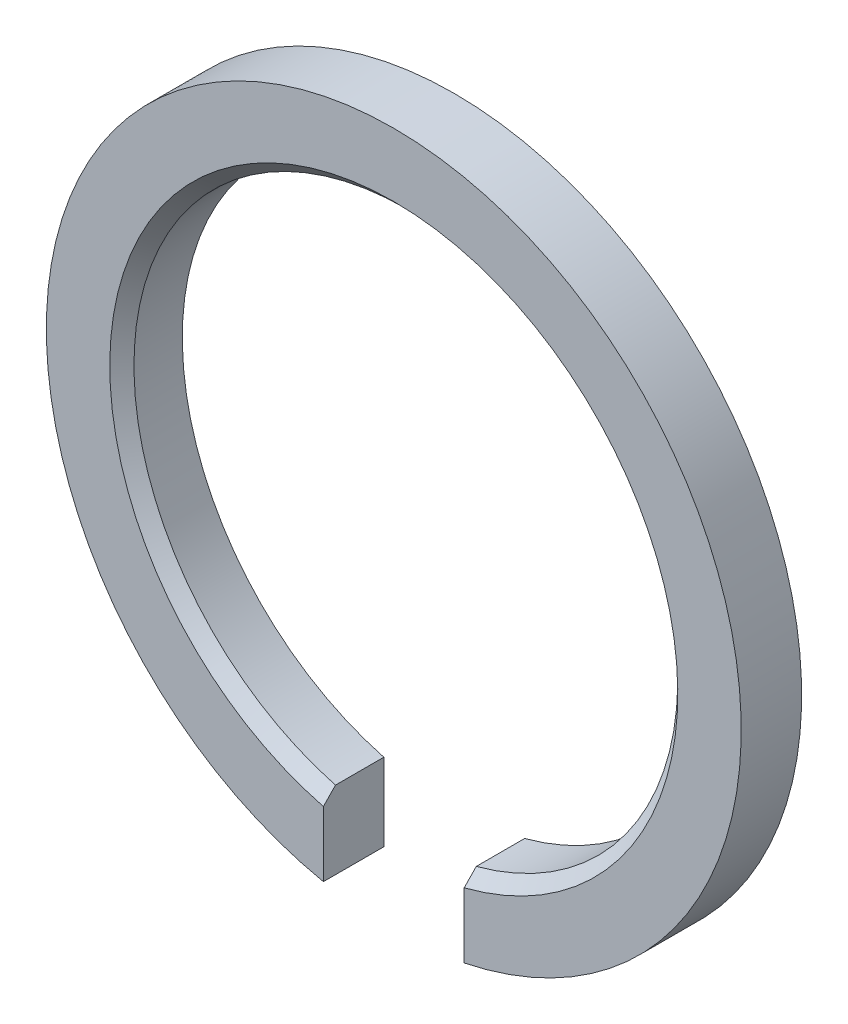
ISO-10303-21;
HEADER;
FILE_DESCRIPTION(('STEP AP214'),'2;1');
FILE_NAME('part.step','',(''),(''),'','','');
FILE_SCHEMA(('AUTOMOTIVE_DESIGN { 1 0 10303 214 1 1 1 1 }'));
ENDSEC;
DATA;
#1=APPLICATION_CONTEXT('core data for automotive mechanical design processes');
#2=APPLICATION_PROTOCOL_DEFINITION('international standard','automotive_design',2000,#1);
#3=PRODUCT_CONTEXT('',#1,'mechanical');
#4=PRODUCT('Part','Part','',(#3));
#5=PRODUCT_RELATED_PRODUCT_CATEGORY('part','',(#4));
#6=PRODUCT_DEFINITION_FORMATION('','',#4);
#7=PRODUCT_DEFINITION_CONTEXT('part definition',#1,'design');
#8=PRODUCT_DEFINITION('design','',#6,#7);
#9=PRODUCT_DEFINITION_SHAPE('','',#8);
#10=(LENGTH_UNIT() NAMED_UNIT(*) SI_UNIT(.MILLI.,.METRE.));
#11=(NAMED_UNIT(*) PLANE_ANGLE_UNIT() SI_UNIT($,.RADIAN.));
#12=(NAMED_UNIT(*) SI_UNIT($,.STERADIAN.) SOLID_ANGLE_UNIT());
#13=UNCERTAINTY_MEASURE_WITH_UNIT(LENGTH_MEASURE(1.E-05),#10,'distance_accuracy_value','');
#14=(GEOMETRIC_REPRESENTATION_CONTEXT(3) GLOBAL_UNCERTAINTY_ASSIGNED_CONTEXT((#13)) GLOBAL_UNIT_ASSIGNED_CONTEXT((#10,
#11,#12)) REPRESENTATION_CONTEXT('',''));
#15=CARTESIAN_POINT('',(0.,0.,0.));
#16=DIRECTION('',(0.,0.,1.));
#17=DIRECTION('',(1.,0.,0.));
#18=AXIS2_PLACEMENT_3D('',#15,#16,#17);
#19=CARTESIAN_POINT('',(0.,0.,10.));
#20=DIRECTION('',(0.,0.,1.));
#21=DIRECTION('',(1.,0.,0.));
#22=AXIS2_PLACEMENT_3D('',#19,#20,#21);
#23=CONICAL_SURFACE('',#22,47.,0.785398163397447);
#24=CARTESIAN_POINT('',(0.,0.,10.));
#25=DIRECTION('',(0.,0.,1.));
#26=DIRECTION('',(1.,0.,0.));
#27=AXIS2_PLACEMENT_3D('',#24,#25,#26);
#28=CIRCLE('',#27,47.);
#29=CARTESIAN_POINT('',(-11.6505113733433,-45.5331262350786,10.));
#30=VERTEX_POINT('',#29);
#31=CARTESIAN_POINT('',(11.6505113733433,-45.5331262350786,10.));
#32=VERTEX_POINT('',#31);
#33=EDGE_CURVE('E126',#30,#32,#28,.F.);
#34=ORIENTED_EDGE('',*,*,#33,.F.);
#35=CARTESIAN_POINT('',(-11.6505113733433,-43.4656828399095,8.));
#36=CARTESIAN_POINT('',(-11.6505113733433,-44.4412381508422,8.94232039661794));
#37=CARTESIAN_POINT('',(-11.6505113733433,-45.4157583045465,9.88571114060221));
#38=CARTESIAN_POINT('',(-11.6505113733433,-47.3630266105597,11.7743149482943));
#39=CARTESIAN_POINT('',(-11.6505113733433,-48.3357747673376,12.719528007394));
#40=CARTESIAN_POINT('',(-11.6505113733433,-50.2798015606856,14.6114620970632));
#41=CARTESIAN_POINT('',(-11.6505113733433,-51.2510801983983,15.558183126459));
#42=CARTESIAN_POINT('',(-11.6505113733433,-53.192384306678,17.4529141431277));
#43=CARTESIAN_POINT('',(-11.6505113733433,-54.162409774083,18.4009241336403));
#44=CARTESIAN_POINT('',(-11.6505113733433,-55.1319140085283,19.3494663462234));
#45=B_SPLINE_CURVE_WITH_KNOTS('',3,(#35,#36,#37,#38,#39,#40,#41,#42,#43,#44),.UNSPECIFIED.,.F.,
.F.,(4,2,2,2,4),(0.,4.06903744118193,8.13806460644451,12.2070886062924,16.276122852952),.UNSPECIFIED.);
#46=CARTESIAN_POINT('',(-11.6505113733433,-43.4656828399095,8.));
#47=VERTEX_POINT('',#46);
#48=EDGE_CURVE('E13',#47,#30,#45,.T.);
#49=ORIENTED_EDGE('',*,*,#48,.F.);
#50=CARTESIAN_POINT('',(0.,0.,8.));
#51=DIRECTION('',(0.,0.,1.));
#52=DIRECTION('',(1.,0.,0.));
#53=AXIS2_PLACEMENT_3D('',#50,#51,#52);
#54=CIRCLE('',#53,45.);
#55=CARTESIAN_POINT('',(11.6505113733433,-43.4656828399095,8.));
#56=VERTEX_POINT('',#55);
#57=EDGE_CURVE('E56',#56,#47,#54,.T.);
#58=ORIENTED_EDGE('',*,*,#57,.F.);
#59=CARTESIAN_POINT('',(11.6505113733433,-45.5331262350786,10.));
#60=CARTESIAN_POINT('',(11.6505113733433,-44.5589308664879,9.05625093304865));
#61=CARTESIAN_POINT('',(11.6505113733433,-43.5838442694424,8.11341964921906));
#62=CARTESIAN_POINT('',(11.6505113733433,-41.6314202571452,6.23010851894641));
#63=CARTESIAN_POINT('',(11.6505113733433,-40.6540828622707,5.2896286513748));
#64=CARTESIAN_POINT('',(11.6505113733433,-38.6966680175043,3.41151599745475));
#65=CARTESIAN_POINT('',(11.6505113733433,-37.7165905583228,2.47388322078142));
#66=CARTESIAN_POINT('',(11.6505113733433,-36.2439117496985,1.07011378596164));
#67=CARTESIAN_POINT('',(11.6505113733433,-35.7525894670133,0.602635140064716));
#68=CARTESIAN_POINT('',(11.6505113733433,-34.7689826510482,-0.33130961638353));
#69=CARTESIAN_POINT('',(11.6505113733433,-34.2766981168282,-0.797775725944764));
#70=CARTESIAN_POINT('',(11.6505113733433,-33.78387817754,-1.26367618269529));
#71=B_SPLINE_CURVE_WITH_KNOTS('',3,(#59,#60,#61,#62,#63,#64,#65,#66,#67,#68,#69,#70),
.UNSPECIFIED.,.F.,.F.,(4,2,2,2,2,4),(0.,4.06908873664586,8.13814077830786,12.2072066321596,
14.2417580886377,16.2763115336751),.UNSPECIFIED.);
#72=EDGE_CURVE('E100',#32,#56,#71,.T.);
#73=ORIENTED_EDGE('',*,*,#72,.F.);
#74=EDGE_LOOP('',(#34,#49,#58,#73));
#75=FACE_BOUND('',#74,.T.);
#76=ADVANCED_FACE('F44',(#75),#23,.F.);
#77=CARTESIAN_POINT('',(0.,0.,10.));
#78=DIRECTION('',(0.,0.,1.));
#79=DIRECTION('',(1.,0.,0.));
#80=AXIS2_PLACEMENT_3D('',#77,#78,#79);
#81=PLANE('',#80);
#82=DIRECTION('',(0.,1.,0.));
#83=VECTOR('',#82,1.);
#84=CARTESIAN_POINT('',(-11.6505113733433,-43.4656828399095,10.));
#85=LINE('',#84,#83);
#86=CARTESIAN_POINT('',(-11.6505113733433,-56.3073315363071,10.));
#87=VERTEX_POINT('',#86);
#88=EDGE_CURVE('E113',#87,#30,#85,.T.);
#89=ORIENTED_EDGE('',*,*,#88,.T.);
#90=ORIENTED_EDGE('',*,*,#33,.T.);
#91=DIRECTION('',(0.,-1.,0.));
#92=VECTOR('',#91,1.);
#93=CARTESIAN_POINT('',(11.6505113733433,-56.6598573857866,10.));
#94=LINE('',#93,#92);
#95=CARTESIAN_POINT('',(11.6505113733433,-56.3073315363071,10.));
#96=VERTEX_POINT('',#95);
#97=EDGE_CURVE('E163',#32,#96,#94,.T.);
#98=ORIENTED_EDGE('',*,*,#97,.T.);
#99=CARTESIAN_POINT('',(0.,0.,10.));
#100=DIRECTION('',(0.,0.,1.));
#101=DIRECTION('',(1.,0.,0.));
#102=AXIS2_PLACEMENT_3D('',#99,#100,#101);
#103=CIRCLE('',#102,57.5);
#104=EDGE_CURVE('E122',#96,#87,#103,.T.);
#105=ORIENTED_EDGE('',*,*,#104,.T.);
#106=EDGE_LOOP('',(#89,#90,#98,#105));
#107=FACE_BOUND('',#106,.T.);
#108=ADVANCED_FACE('F149',(#107),#81,.T.);
#109=CARTESIAN_POINT('',(0.,0.,0.));
#110=DIRECTION('',(0.,0.,1.));
#111=DIRECTION('',(1.,0.,0.));
#112=AXIS2_PLACEMENT_3D('',#109,#110,#111);
#113=PLANE('',#112);
#114=DIRECTION('',(0.,1.,0.));
#115=VECTOR('',#114,1.);
#116=CARTESIAN_POINT('',(-11.6505113733433,-43.4656828399095,0.));
#117=LINE('',#116,#115);
#118=CARTESIAN_POINT('',(-11.6505113733433,-56.3073315363071,0.));
#119=VERTEX_POINT('',#118);
#120=CARTESIAN_POINT('',(-11.6505113733433,-43.4656828399095,0.));
#121=VERTEX_POINT('',#120);
#122=EDGE_CURVE('E112',#119,#121,#117,.T.);
#123=ORIENTED_EDGE('',*,*,#122,.F.);
#124=CARTESIAN_POINT('',(0.,0.,0.));
#125=DIRECTION('',(0.,0.,1.));
#126=DIRECTION('',(1.,0.,0.));
#127=AXIS2_PLACEMENT_3D('',#124,#125,#126);
#128=CIRCLE('',#127,57.5);
#129=CARTESIAN_POINT('',(11.6505113733433,-56.3073315363071,0.));
#130=VERTEX_POINT('',#129);
#131=EDGE_CURVE('E115',#130,#119,#128,.T.);
#132=ORIENTED_EDGE('',*,*,#131,.F.);
#133=DIRECTION('',(0.,-1.,0.));
#134=VECTOR('',#133,1.);
#135=CARTESIAN_POINT('',(11.6505113733433,-56.6598573857866,0.));
#136=LINE('',#135,#134);
#137=CARTESIAN_POINT('',(11.6505113733433,-43.4656828399095,0.));
#138=VERTEX_POINT('',#137);
#139=EDGE_CURVE('E97',#138,#130,#136,.T.);
#140=ORIENTED_EDGE('',*,*,#139,.F.);
#141=CARTESIAN_POINT('',(0.,0.,0.));
#142=DIRECTION('',(0.,0.,1.));
#143=DIRECTION('',(1.,0.,0.));
#144=AXIS2_PLACEMENT_3D('',#141,#142,#143);
#145=CIRCLE('',#144,45.);
#146=EDGE_CURVE('E109',#138,#121,#145,.T.);
#147=ORIENTED_EDGE('',*,*,#146,.T.);
#148=EDGE_LOOP('',(#123,#132,#140,#147));
#149=FACE_BOUND('',#148,.T.);
#150=ADVANCED_FACE('F107',(#149),#113,.F.);
#151=CARTESIAN_POINT('',(0.,0.,10.));
#152=DIRECTION('',(0.,0.,-1.));
#153=DIRECTION('',(-1.,0.,0.));
#154=AXIS2_PLACEMENT_3D('',#151,#152,#153);
#155=CYLINDRICAL_SURFACE('',#154,57.5);
#156=ORIENTED_EDGE('',*,*,#104,.F.);
#157=DIRECTION('',(0.,0.,-1.));
#158=VECTOR('',#157,1.);
#159=CARTESIAN_POINT('',(11.6505113733433,-56.3073315363071,10.));
#160=LINE('',#159,#158);
#161=EDGE_CURVE('E118',#96,#130,#160,.T.);
#162=ORIENTED_EDGE('',*,*,#161,.T.);
#163=ORIENTED_EDGE('',*,*,#131,.T.);
#164=DIRECTION('',(0.,0.,-1.));
#165=VECTOR('',#164,1.);
#166=CARTESIAN_POINT('',(-11.6505113733433,-56.3073315363071,10.));
#167=LINE('',#166,#165);
#168=EDGE_CURVE('E105',#119,#87,#167,.F.);
#169=ORIENTED_EDGE('',*,*,#168,.T.);
#170=EDGE_LOOP('',(#156,#162,#163,#169));
#171=FACE_BOUND('',#170,.T.);
#172=ADVANCED_FACE('F143',(#171),#155,.T.);
#173=CARTESIAN_POINT('',(0.,0.,10.));
#174=DIRECTION('',(0.,0.,-1.));
#175=DIRECTION('',(-1.,0.,0.));
#176=AXIS2_PLACEMENT_3D('',#173,#174,#175);
#177=CYLINDRICAL_SURFACE('',#176,45.);
#178=DIRECTION('',(0.,0.,-1.));
#179=VECTOR('',#178,1.);
#180=CARTESIAN_POINT('',(11.6505113733433,-43.4656828399095,10.));
#181=LINE('',#180,#179);
#182=EDGE_CURVE('E95',#56,#138,#181,.T.);
#183=ORIENTED_EDGE('',*,*,#182,.F.);
#184=ORIENTED_EDGE('',*,*,#57,.T.);
#185=DIRECTION('',(0.,0.,-1.));
#186=VECTOR('',#185,1.);
#187=CARTESIAN_POINT('',(-11.6505113733433,-43.4656828399095,10.));
#188=LINE('',#187,#186);
#189=EDGE_CURVE('E101',#47,#121,#188,.T.);
#190=ORIENTED_EDGE('',*,*,#189,.T.);
#191=ORIENTED_EDGE('',*,*,#146,.F.);
#192=EDGE_LOOP('',(#183,#184,#190,#191));
#193=FACE_BOUND('',#192,.T.);
#194=ADVANCED_FACE('F116',(#193),#177,.F.);
#195=CARTESIAN_POINT('',(-11.6505113733433,-43.4656828399095,10.));
#196=DIRECTION('',(-1.,0.,0.));
#197=DIRECTION('',(0.,-1.,0.));
#198=AXIS2_PLACEMENT_3D('',#195,#196,#197);
#199=PLANE('',#198);
#200=ORIENTED_EDGE('',*,*,#189,.F.);
#201=ORIENTED_EDGE('',*,*,#48,.T.);
#202=ORIENTED_EDGE('',*,*,#88,.F.);
#203=ORIENTED_EDGE('',*,*,#168,.F.);
#204=ORIENTED_EDGE('',*,*,#122,.T.);
#205=EDGE_LOOP('',(#200,#201,#202,#203,#204));
#206=FACE_BOUND('',#205,.T.);
#207=ADVANCED_FACE('F137',(#206),#199,.F.);
#208=CARTESIAN_POINT('',(11.6505113733433,-56.6598573857866,10.));
#209=DIRECTION('',(1.,0.,0.));
#210=DIRECTION('',(0.,1.,0.));
#211=AXIS2_PLACEMENT_3D('',#208,#209,#210);
#212=PLANE('',#211);
#213=ORIENTED_EDGE('',*,*,#97,.F.);
#214=ORIENTED_EDGE('',*,*,#72,.T.);
#215=ORIENTED_EDGE('',*,*,#182,.T.);
#216=ORIENTED_EDGE('',*,*,#139,.T.);
#217=ORIENTED_EDGE('',*,*,#161,.F.);
#218=EDGE_LOOP('',(#213,#214,#215,#216,#217));
#219=FACE_BOUND('',#218,.T.);
#220=ADVANCED_FACE('F94',(#219),#212,.F.);
#221=CLOSED_SHELL('',(#76,#108,#150,#172,#194,#207,#220));
#222=MANIFOLD_SOLID_BREP('B2',#221);
#223=ADVANCED_BREP_SHAPE_REPRESENTATION('',(#18,#222),#14);
#224=SHAPE_DEFINITION_REPRESENTATION(#9,#223);
ENDSEC;
END-ISO-10303-21;
